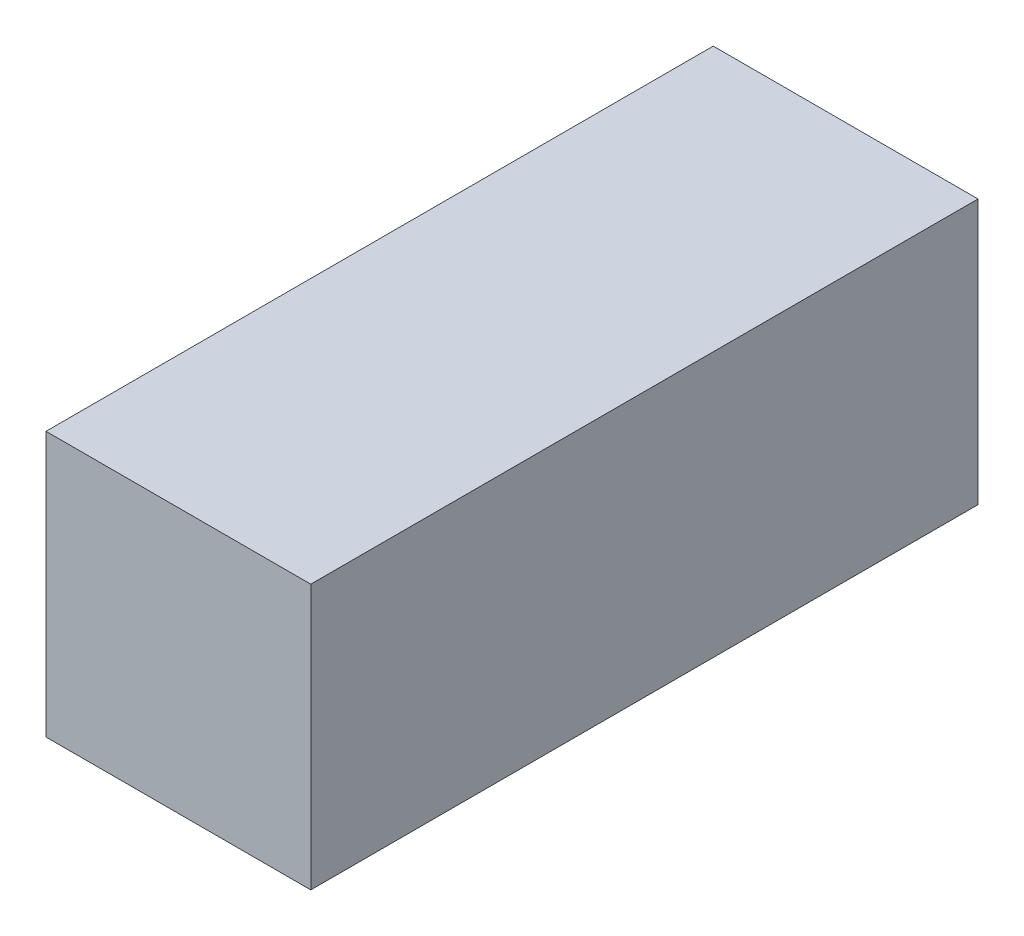
ISO-10303-21;
HEADER;
FILE_DESCRIPTION(('STEP AP214'),'2;1');
FILE_NAME('part.step','',(''),(''),'','','');
FILE_SCHEMA(('AUTOMOTIVE_DESIGN { 1 0 10303 214 1 1 1 1 }'));
ENDSEC;
DATA;
#1=APPLICATION_CONTEXT('core data for automotive mechanical design processes');
#2=APPLICATION_PROTOCOL_DEFINITION('international standard','automotive_design',2000,#1);
#3=PRODUCT_CONTEXT('',#1,'mechanical');
#4=PRODUCT('Part','Part','',(#3));
#5=PRODUCT_RELATED_PRODUCT_CATEGORY('part','',(#4));
#6=PRODUCT_DEFINITION_FORMATION('','',#4);
#7=PRODUCT_DEFINITION_CONTEXT('part definition',#1,'design');
#8=PRODUCT_DEFINITION('design','',#6,#7);
#9=PRODUCT_DEFINITION_SHAPE('','',#8);
#10=(LENGTH_UNIT() NAMED_UNIT(*) SI_UNIT(.MILLI.,.METRE.));
#11=(NAMED_UNIT(*) PLANE_ANGLE_UNIT() SI_UNIT($,.RADIAN.));
#12=(NAMED_UNIT(*) SI_UNIT($,.STERADIAN.) SOLID_ANGLE_UNIT());
#13=UNCERTAINTY_MEASURE_WITH_UNIT(LENGTH_MEASURE(1.E-05),#10,'distance_accuracy_value','');
#14=(GEOMETRIC_REPRESENTATION_CONTEXT(3) GLOBAL_UNCERTAINTY_ASSIGNED_CONTEXT((#13)) GLOBAL_UNIT_ASSIGNED_CONTEXT((#10,
#11,#12)) REPRESENTATION_CONTEXT('',''));
#15=CARTESIAN_POINT('',(0.,0.,0.));
#16=DIRECTION('',(0.,0.,1.));
#17=DIRECTION('',(1.,0.,0.));
#18=AXIS2_PLACEMENT_3D('',#15,#16,#17);
#19=CARTESIAN_POINT('',(0.,0.,3200.4));
#20=DIRECTION('',(1.,0.,0.));
#21=DIRECTION('',(0.,1.,0.));
#22=AXIS2_PLACEMENT_3D('',#19,#20,#21);
#23=PLANE('',#22);
#24=DIRECTION('',(0.,-1.,0.));
#25=VECTOR('',#24,1.);
#26=CARTESIAN_POINT('',(0.,0.,0.));
#27=LINE('',#26,#25);
#28=CARTESIAN_POINT('',(-4.44089209850063E-13,1270.,0.));
#29=VERTEX_POINT('',#28);
#30=CARTESIAN_POINT('',(0.,0.,0.));
#31=VERTEX_POINT('',#30);
#32=EDGE_CURVE('E101',#29,#31,#27,.T.);
#33=ORIENTED_EDGE('',*,*,#32,.T.);
#34=DIRECTION('',(0.,0.,-1.));
#35=VECTOR('',#34,1.);
#36=CARTESIAN_POINT('',(0.,0.,3200.4));
#37=LINE('',#36,#35);
#38=CARTESIAN_POINT('',(0.,0.,3200.4));
#39=VERTEX_POINT('',#38);
#40=EDGE_CURVE('E11',#39,#31,#37,.T.);
#41=ORIENTED_EDGE('',*,*,#40,.F.);
#42=DIRECTION('',(0.,-1.,0.));
#43=VECTOR('',#42,1.);
#44=CARTESIAN_POINT('',(0.,0.,3200.4));
#45=LINE('',#44,#43);
#46=CARTESIAN_POINT('',(-4.44089209850063E-13,1270.,3200.4));
#47=VERTEX_POINT('',#46);
#48=EDGE_CURVE('E89',#47,#39,#45,.T.);
#49=ORIENTED_EDGE('',*,*,#48,.F.);
#50=DIRECTION('',(0.,0.,-1.));
#51=VECTOR('',#50,1.);
#52=CARTESIAN_POINT('',(-4.44089209850063E-13,1270.,3200.4));
#53=LINE('',#52,#51);
#54=EDGE_CURVE('E97',#47,#29,#53,.T.);
#55=ORIENTED_EDGE('',*,*,#54,.T.);
#56=EDGE_LOOP('',(#33,#41,#49,#55));
#57=FACE_BOUND('',#56,.T.);
#58=ADVANCED_FACE('F38',(#57),#23,.F.);
#59=CARTESIAN_POINT('',(0.,0.,3200.4));
#60=DIRECTION('',(0.,1.,0.));
#61=DIRECTION('',(0.,0.,1.));
#62=AXIS2_PLACEMENT_3D('',#59,#60,#61);
#63=PLANE('',#62);
#64=DIRECTION('',(1.,0.,0.));
#65=VECTOR('',#64,1.);
#66=CARTESIAN_POINT('',(0.,0.,0.));
#67=LINE('',#66,#65);
#68=CARTESIAN_POINT('',(1270.,0.,0.));
#69=VERTEX_POINT('',#68);
#70=EDGE_CURVE('E93',#31,#69,#67,.T.);
#71=ORIENTED_EDGE('',*,*,#70,.T.);
#72=DIRECTION('',(0.,0.,-1.));
#73=VECTOR('',#72,1.);
#74=CARTESIAN_POINT('',(1270.,0.,3200.4));
#75=LINE('',#74,#73);
#76=CARTESIAN_POINT('',(1270.,0.,3200.4));
#77=VERTEX_POINT('',#76);
#78=EDGE_CURVE('E46',#77,#69,#75,.T.);
#79=ORIENTED_EDGE('',*,*,#78,.F.);
#80=DIRECTION('',(1.,0.,0.));
#81=VECTOR('',#80,1.);
#82=CARTESIAN_POINT('',(0.,0.,3200.4));
#83=LINE('',#82,#81);
#84=EDGE_CURVE('E84',#39,#77,#83,.T.);
#85=ORIENTED_EDGE('',*,*,#84,.F.);
#86=ORIENTED_EDGE('',*,*,#40,.T.);
#87=EDGE_LOOP('',(#71,#79,#85,#86));
#88=FACE_BOUND('',#87,.T.);
#89=ADVANCED_FACE('F92',(#88),#63,.F.);
#90=CARTESIAN_POINT('',(1270.,0.,3200.4));
#91=DIRECTION('',(-1.,0.,0.));
#92=DIRECTION('',(0.,-1.,0.));
#93=AXIS2_PLACEMENT_3D('',#90,#91,#92);
#94=PLANE('',#93);
#95=DIRECTION('',(0.,1.,0.));
#96=VECTOR('',#95,1.);
#97=CARTESIAN_POINT('',(1270.,0.,0.));
#98=LINE('',#97,#96);
#99=CARTESIAN_POINT('',(1270.,1270.,0.));
#100=VERTEX_POINT('',#99);
#101=EDGE_CURVE('E71',#69,#100,#98,.T.);
#102=ORIENTED_EDGE('',*,*,#101,.T.);
#103=DIRECTION('',(0.,0.,-1.));
#104=VECTOR('',#103,1.);
#105=CARTESIAN_POINT('',(1270.,1270.,3200.4));
#106=LINE('',#105,#104);
#107=CARTESIAN_POINT('',(1270.,1270.,3200.4));
#108=VERTEX_POINT('',#107);
#109=EDGE_CURVE('E94',#108,#100,#106,.T.);
#110=ORIENTED_EDGE('',*,*,#109,.F.);
#111=DIRECTION('',(0.,1.,0.));
#112=VECTOR('',#111,1.);
#113=CARTESIAN_POINT('',(1270.,0.,3200.4));
#114=LINE('',#113,#112);
#115=EDGE_CURVE('E87',#77,#108,#114,.T.);
#116=ORIENTED_EDGE('',*,*,#115,.F.);
#117=ORIENTED_EDGE('',*,*,#78,.T.);
#118=EDGE_LOOP('',(#102,#110,#116,#117));
#119=FACE_BOUND('',#118,.T.);
#120=ADVANCED_FACE('F95',(#119),#94,.F.);
#121=CARTESIAN_POINT('',(-4.44089209850063E-13,1270.,3200.4));
#122=DIRECTION('',(0.,-1.,0.));
#123=DIRECTION('',(0.,0.,-1.));
#124=AXIS2_PLACEMENT_3D('',#121,#122,#123);
#125=PLANE('',#124);
#126=DIRECTION('',(-1.,0.,0.));
#127=VECTOR('',#126,1.);
#128=CARTESIAN_POINT('',(-4.44089209850063E-13,1270.,0.));
#129=LINE('',#128,#127);
#130=EDGE_CURVE('E77',#100,#29,#129,.T.);
#131=ORIENTED_EDGE('',*,*,#130,.T.);
#132=ORIENTED_EDGE('',*,*,#54,.F.);
#133=DIRECTION('',(-1.,0.,0.));
#134=VECTOR('',#133,1.);
#135=CARTESIAN_POINT('',(-4.44089209850063E-13,1270.,3200.4));
#136=LINE('',#135,#134);
#137=EDGE_CURVE('E54',#108,#47,#136,.T.);
#138=ORIENTED_EDGE('',*,*,#137,.F.);
#139=ORIENTED_EDGE('',*,*,#109,.T.);
#140=EDGE_LOOP('',(#131,#132,#138,#139));
#141=FACE_BOUND('',#140,.T.);
#142=ADVANCED_FACE('F108',(#141),#125,.F.);
#143=CARTESIAN_POINT('',(0.,0.,3200.4));
#144=DIRECTION('',(0.,0.,-1.));
#145=DIRECTION('',(-1.,0.,0.));
#146=AXIS2_PLACEMENT_3D('',#143,#144,#145);
#147=PLANE('',#146);
#148=ORIENTED_EDGE('',*,*,#48,.T.);
#149=ORIENTED_EDGE('',*,*,#84,.T.);
#150=ORIENTED_EDGE('',*,*,#115,.T.);
#151=ORIENTED_EDGE('',*,*,#137,.T.);
#152=EDGE_LOOP('',(#148,#149,#150,#151));
#153=FACE_BOUND('',#152,.T.);
#154=ADVANCED_FACE('F85',(#153),#147,.F.);
#155=CARTESIAN_POINT('',(0.,0.,0.));
#156=DIRECTION('',(0.,0.,-1.));
#157=DIRECTION('',(-1.,0.,0.));
#158=AXIS2_PLACEMENT_3D('',#155,#156,#157);
#159=PLANE('',#158);
#160=ORIENTED_EDGE('',*,*,#32,.F.);
#161=ORIENTED_EDGE('',*,*,#130,.F.);
#162=ORIENTED_EDGE('',*,*,#101,.F.);
#163=ORIENTED_EDGE('',*,*,#70,.F.);
#164=EDGE_LOOP('',(#160,#161,#162,#163));
#165=FACE_BOUND('',#164,.T.);
#166=ADVANCED_FACE('F111',(#165),#159,.T.);
#167=CLOSED_SHELL('',(#58,#89,#120,#142,#154,#166));
#168=MANIFOLD_SOLID_BREP('B2',#167);
#169=ADVANCED_BREP_SHAPE_REPRESENTATION('',(#18,#168),#14);
#170=SHAPE_DEFINITION_REPRESENTATION(#9,#169);
ENDSEC;
END-ISO-10303-21;
